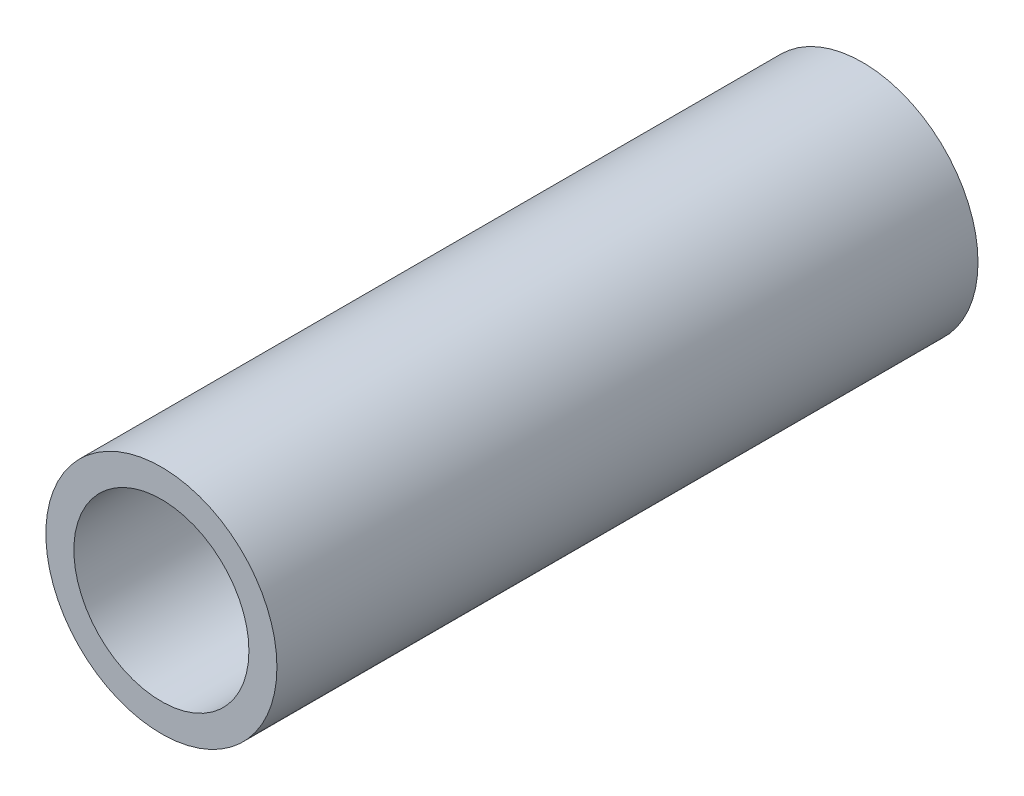
ISO-10303-21;
HEADER;
FILE_DESCRIPTION(('STEP AP214'),'2;1');
FILE_NAME('part.step','',(''),(''),'','','');
FILE_SCHEMA(('AUTOMOTIVE_DESIGN { 1 0 10303 214 1 1 1 1 }'));
ENDSEC;
DATA;
#1=APPLICATION_CONTEXT('core data for automotive mechanical design processes');
#2=APPLICATION_PROTOCOL_DEFINITION('international standard','automotive_design',2000,#1);
#3=PRODUCT_CONTEXT('',#1,'mechanical');
#4=PRODUCT('Part','Part','',(#3));
#5=PRODUCT_RELATED_PRODUCT_CATEGORY('part','',(#4));
#6=PRODUCT_DEFINITION_FORMATION('','',#4);
#7=PRODUCT_DEFINITION_CONTEXT('part definition',#1,'design');
#8=PRODUCT_DEFINITION('design','',#6,#7);
#9=PRODUCT_DEFINITION_SHAPE('','',#8);
#10=(LENGTH_UNIT() NAMED_UNIT(*) SI_UNIT(.MILLI.,.METRE.));
#11=(NAMED_UNIT(*) PLANE_ANGLE_UNIT() SI_UNIT($,.RADIAN.));
#12=(NAMED_UNIT(*) SI_UNIT($,.STERADIAN.) SOLID_ANGLE_UNIT());
#13=UNCERTAINTY_MEASURE_WITH_UNIT(LENGTH_MEASURE(1.E-05),#10,'distance_accuracy_value','');
#14=(GEOMETRIC_REPRESENTATION_CONTEXT(3) GLOBAL_UNCERTAINTY_ASSIGNED_CONTEXT((#13)) GLOBAL_UNIT_ASSIGNED_CONTEXT((#10,
#11,#12)) REPRESENTATION_CONTEXT('',''));
#15=CARTESIAN_POINT('',(0.,0.,0.));
#16=DIRECTION('',(0.,0.,1.));
#17=DIRECTION('',(1.,0.,0.));
#18=AXIS2_PLACEMENT_3D('',#15,#16,#17);
#19=CARTESIAN_POINT('',(0.,0.,44.5));
#20=DIRECTION('',(0.,0.,1.));
#21=DIRECTION('',(1.,0.,0.));
#22=AXIS2_PLACEMENT_3D('',#19,#20,#21);
#23=PLANE('',#22);
#24=CARTESIAN_POINT('',(0.,0.,44.5));
#25=DIRECTION('',(0.,0.,1.));
#26=DIRECTION('',(1.,0.,0.));
#27=AXIS2_PLACEMENT_3D('',#24,#25,#26);
#28=CIRCLE('',#27,14.6685);
#29=CARTESIAN_POINT('',(14.6685,0.,44.5));
#30=VERTEX_POINT('',#29);
#31=EDGE_CURVE('E10',#30,#30,#28,.T.);
#32=ORIENTED_EDGE('',*,*,#31,.T.);
#33=EDGE_LOOP('',(#32));
#34=FACE_BOUND('',#33,.T.);
#35=CARTESIAN_POINT('',(0.,0.,44.5));
#36=DIRECTION('',(0.,0.,1.));
#37=DIRECTION('',(1.,0.,0.));
#38=AXIS2_PLACEMENT_3D('',#35,#36,#37);
#39=CIRCLE('',#38,11.1125);
#40=CARTESIAN_POINT('',(11.1125,0.,44.5));
#41=VERTEX_POINT('',#40);
#42=EDGE_CURVE('E46',#41,#41,#39,.T.);
#43=ORIENTED_EDGE('',*,*,#42,.F.);
#44=EDGE_LOOP('',(#43));
#45=FACE_BOUND('',#44,.T.);
#46=ADVANCED_FACE('F35',(#34,#45),#23,.T.);
#47=CARTESIAN_POINT('',(0.,0.,-44.5));
#48=DIRECTION('',(0.,0.,1.));
#49=DIRECTION('',(1.,0.,0.));
#50=AXIS2_PLACEMENT_3D('',#47,#48,#49);
#51=PLANE('',#50);
#52=CARTESIAN_POINT('',(0.,0.,-44.5));
#53=DIRECTION('',(0.,0.,1.));
#54=DIRECTION('',(1.,0.,0.));
#55=AXIS2_PLACEMENT_3D('',#52,#53,#54);
#56=CIRCLE('',#55,14.6685);
#57=CARTESIAN_POINT('',(14.6685,0.,-44.5));
#58=VERTEX_POINT('',#57);
#59=EDGE_CURVE('E39',#58,#58,#56,.T.);
#60=ORIENTED_EDGE('',*,*,#59,.F.);
#61=EDGE_LOOP('',(#60));
#62=FACE_BOUND('',#61,.T.);
#63=CARTESIAN_POINT('',(0.,0.,-44.5));
#64=DIRECTION('',(0.,0.,1.));
#65=DIRECTION('',(1.,0.,0.));
#66=AXIS2_PLACEMENT_3D('',#63,#64,#65);
#67=CIRCLE('',#66,11.1125);
#68=CARTESIAN_POINT('',(11.1125,0.,-44.5));
#69=VERTEX_POINT('',#68);
#70=EDGE_CURVE('E48',#69,#69,#67,.T.);
#71=ORIENTED_EDGE('',*,*,#70,.T.);
#72=EDGE_LOOP('',(#71));
#73=FACE_BOUND('',#72,.T.);
#74=ADVANCED_FACE('F58',(#62,#73),#51,.F.);
#75=CARTESIAN_POINT('',(0.,0.,44.5));
#76=DIRECTION('',(0.,0.,-1.));
#77=DIRECTION('',(-1.,0.,0.));
#78=AXIS2_PLACEMENT_3D('',#75,#76,#77);
#79=CYLINDRICAL_SURFACE('',#78,14.6685);
#80=ORIENTED_EDGE('',*,*,#31,.F.);
#81=EDGE_LOOP('',(#80));
#82=FACE_BOUND('',#81,.T.);
#83=ORIENTED_EDGE('',*,*,#59,.T.);
#84=EDGE_LOOP('',(#83));
#85=FACE_BOUND('',#84,.T.);
#86=ADVANCED_FACE('F37',(#82,#85),#79,.T.);
#87=CARTESIAN_POINT('',(0.,0.,44.5));
#88=DIRECTION('',(0.,0.,-1.));
#89=DIRECTION('',(-1.,0.,0.));
#90=AXIS2_PLACEMENT_3D('',#87,#88,#89);
#91=CYLINDRICAL_SURFACE('',#90,11.1125);
#92=ORIENTED_EDGE('',*,*,#42,.T.);
#93=EDGE_LOOP('',(#92));
#94=FACE_BOUND('',#93,.T.);
#95=ORIENTED_EDGE('',*,*,#70,.F.);
#96=EDGE_LOOP('',(#95));
#97=FACE_BOUND('',#96,.T.);
#98=ADVANCED_FACE('F54',(#94,#97),#91,.F.);
#99=CLOSED_SHELL('',(#46,#74,#86,#98));
#100=MANIFOLD_SOLID_BREP('B2',#99);
#101=ADVANCED_BREP_SHAPE_REPRESENTATION('',(#18,#100),#14);
#102=SHAPE_DEFINITION_REPRESENTATION(#9,#101);
ENDSEC;
END-ISO-10303-21;
